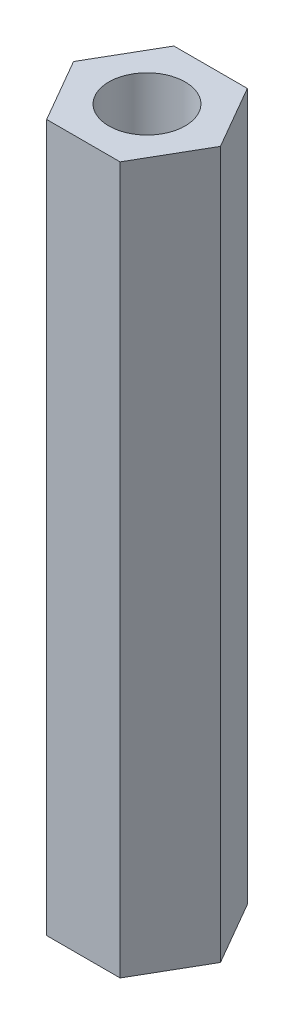
ISO-10303-21;
HEADER;
FILE_DESCRIPTION(('STEP AP214'),'2;1');
FILE_NAME('part.step','',(''),(''),'','','');
FILE_SCHEMA(('AUTOMOTIVE_DESIGN { 1 0 10303 214 1 1 1 1 }'));
ENDSEC;
DATA;
#1=APPLICATION_CONTEXT('core data for automotive mechanical design processes');
#2=APPLICATION_PROTOCOL_DEFINITION('international standard','automotive_design',2000,#1);
#3=PRODUCT_CONTEXT('',#1,'mechanical');
#4=PRODUCT('Part','Part','',(#3));
#5=PRODUCT_RELATED_PRODUCT_CATEGORY('part','',(#4));
#6=PRODUCT_DEFINITION_FORMATION('','',#4);
#7=PRODUCT_DEFINITION_CONTEXT('part definition',#1,'design');
#8=PRODUCT_DEFINITION('design','',#6,#7);
#9=PRODUCT_DEFINITION_SHAPE('','',#8);
#10=(LENGTH_UNIT() NAMED_UNIT(*) SI_UNIT(.MILLI.,.METRE.));
#11=(NAMED_UNIT(*) PLANE_ANGLE_UNIT() SI_UNIT($,.RADIAN.));
#12=(NAMED_UNIT(*) SI_UNIT($,.STERADIAN.) SOLID_ANGLE_UNIT());
#13=UNCERTAINTY_MEASURE_WITH_UNIT(LENGTH_MEASURE(1.E-05),#10,'distance_accuracy_value','');
#14=(GEOMETRIC_REPRESENTATION_CONTEXT(3) GLOBAL_UNCERTAINTY_ASSIGNED_CONTEXT((#13)) GLOBAL_UNIT_ASSIGNED_CONTEXT((#10,
#11,#12)) REPRESENTATION_CONTEXT('',''));
#15=CARTESIAN_POINT('',(0.,0.,0.));
#16=DIRECTION('',(0.,0.,1.));
#17=DIRECTION('',(1.,0.,0.));
#18=AXIS2_PLACEMENT_3D('',#15,#16,#17);
#19=CARTESIAN_POINT('',(0.,25.,0.));
#20=DIRECTION('',(0.,1.,0.));
#21=DIRECTION('',(0.,0.,1.));
#22=AXIS2_PLACEMENT_3D('',#19,#20,#21);
#23=PLANE('',#22);
#24=DIRECTION('',(0.5,0.,0.866025403784439));
#25=VECTOR('',#24,1.);
#26=CARTESIAN_POINT('',(-2.59807621135332,25.,0.));
#27=LINE('',#26,#25);
#28=CARTESIAN_POINT('',(-2.59807621135332,25.,0.));
#29=VERTEX_POINT('',#28);
#30=CARTESIAN_POINT('',(-1.29903810567666,25.,2.25));
#31=VERTEX_POINT('',#30);
#32=EDGE_CURVE('E126',#29,#31,#27,.T.);
#33=ORIENTED_EDGE('',*,*,#32,.T.);
#34=DIRECTION('',(1.,0.,0.));
#35=VECTOR('',#34,1.);
#36=CARTESIAN_POINT('',(-1.29903810567666,25.,2.25));
#37=LINE('',#36,#35);
#38=CARTESIAN_POINT('',(1.29903810567666,25.,2.25));
#39=VERTEX_POINT('',#38);
#40=EDGE_CURVE('E84',#31,#39,#37,.T.);
#41=ORIENTED_EDGE('',*,*,#40,.T.);
#42=DIRECTION('',(0.5,0.,-0.866025403784439));
#43=VECTOR('',#42,1.);
#44=CARTESIAN_POINT('',(1.29903810567666,25.,2.25));
#45=LINE('',#44,#43);
#46=CARTESIAN_POINT('',(2.59807621135332,25.,0.));
#47=VERTEX_POINT('',#46);
#48=EDGE_CURVE('E97',#39,#47,#45,.T.);
#49=ORIENTED_EDGE('',*,*,#48,.T.);
#50=DIRECTION('',(-0.5,0.,-0.866025403784439));
#51=VECTOR('',#50,1.);
#52=CARTESIAN_POINT('',(2.59807621135332,25.,0.));
#53=LINE('',#52,#51);
#54=CARTESIAN_POINT('',(1.29903810567666,25.,-2.25));
#55=VERTEX_POINT('',#54);
#56=EDGE_CURVE('E91',#47,#55,#53,.T.);
#57=ORIENTED_EDGE('',*,*,#56,.T.);
#58=DIRECTION('',(-1.,0.,0.));
#59=VECTOR('',#58,1.);
#60=CARTESIAN_POINT('',(1.29903810567666,25.,-2.25));
#61=LINE('',#60,#59);
#62=CARTESIAN_POINT('',(-1.29903810567666,25.,-2.25));
#63=VERTEX_POINT('',#62);
#64=EDGE_CURVE('E95',#55,#63,#61,.T.);
#65=ORIENTED_EDGE('',*,*,#64,.T.);
#66=DIRECTION('',(-0.5,0.,0.866025403784438));
#67=VECTOR('',#66,1.);
#68=CARTESIAN_POINT('',(-1.29903810567666,25.,-2.25));
#69=LINE('',#68,#67);
#70=EDGE_CURVE('E47',#63,#29,#69,.T.);
#71=ORIENTED_EDGE('',*,*,#70,.T.);
#72=EDGE_LOOP('',(#33,#41,#49,#57,#65,#71));
#73=FACE_BOUND('',#72,.T.);
#74=CARTESIAN_POINT('',(0.,25.,0.));
#75=DIRECTION('',(0.,1.,0.));
#76=DIRECTION('',(0.,0.,1.));
#77=AXIS2_PLACEMENT_3D('',#74,#75,#76);
#78=CIRCLE('',#77,1.35);
#79=CARTESIAN_POINT('',(0.,25.,1.35));
#80=VERTEX_POINT('',#79);
#81=EDGE_CURVE('E119',#80,#80,#78,.T.);
#82=ORIENTED_EDGE('',*,*,#81,.F.);
#83=EDGE_LOOP('',(#82));
#84=FACE_BOUND('',#83,.T.);
#85=ADVANCED_FACE('F30',(#73,#84),#23,.T.);
#86=CARTESIAN_POINT('',(0.,0.,0.));
#87=DIRECTION('',(0.,1.,0.));
#88=DIRECTION('',(0.,0.,1.));
#89=AXIS2_PLACEMENT_3D('',#86,#87,#88);
#90=PLANE('',#89);
#91=DIRECTION('',(0.5,0.,0.866025403784439));
#92=VECTOR('',#91,1.);
#93=CARTESIAN_POINT('',(-2.59807621135332,0.,0.));
#94=LINE('',#93,#92);
#95=CARTESIAN_POINT('',(-2.59807621135332,0.,0.));
#96=VERTEX_POINT('',#95);
#97=CARTESIAN_POINT('',(-1.29903810567666,0.,2.25));
#98=VERTEX_POINT('',#97);
#99=EDGE_CURVE('E115',#96,#98,#94,.T.);
#100=ORIENTED_EDGE('',*,*,#99,.F.);
#101=DIRECTION('',(-0.5,0.,0.866025403784438));
#102=VECTOR('',#101,1.);
#103=CARTESIAN_POINT('',(-1.29903810567666,0.,-2.25));
#104=LINE('',#103,#102);
#105=CARTESIAN_POINT('',(-1.29903810567666,0.,-2.25));
#106=VERTEX_POINT('',#105);
#107=EDGE_CURVE('E76',#106,#96,#104,.T.);
#108=ORIENTED_EDGE('',*,*,#107,.F.);
#109=DIRECTION('',(-1.,0.,0.));
#110=VECTOR('',#109,1.);
#111=CARTESIAN_POINT('',(1.29903810567666,0.,-2.25));
#112=LINE('',#111,#110);
#113=CARTESIAN_POINT('',(1.29903810567666,0.,-2.25));
#114=VERTEX_POINT('',#113);
#115=EDGE_CURVE('E70',#114,#106,#112,.T.);
#116=ORIENTED_EDGE('',*,*,#115,.F.);
#117=DIRECTION('',(-0.5,0.,-0.866025403784439));
#118=VECTOR('',#117,1.);
#119=CARTESIAN_POINT('',(2.59807621135332,0.,0.));
#120=LINE('',#119,#118);
#121=CARTESIAN_POINT('',(2.59807621135332,0.,0.));
#122=VERTEX_POINT('',#121);
#123=EDGE_CURVE('E105',#122,#114,#120,.T.);
#124=ORIENTED_EDGE('',*,*,#123,.F.);
#125=DIRECTION('',(0.5,0.,-0.866025403784439));
#126=VECTOR('',#125,1.);
#127=CARTESIAN_POINT('',(1.29903810567666,0.,2.25));
#128=LINE('',#127,#126);
#129=CARTESIAN_POINT('',(1.29903810567666,0.,2.25));
#130=VERTEX_POINT('',#129);
#131=EDGE_CURVE('E121',#130,#122,#128,.T.);
#132=ORIENTED_EDGE('',*,*,#131,.F.);
#133=DIRECTION('',(1.,0.,0.));
#134=VECTOR('',#133,1.);
#135=CARTESIAN_POINT('',(-1.29903810567666,0.,2.25));
#136=LINE('',#135,#134);
#137=EDGE_CURVE('E118',#98,#130,#136,.T.);
#138=ORIENTED_EDGE('',*,*,#137,.F.);
#139=EDGE_LOOP('',(#100,#108,#116,#124,#132,#138));
#140=FACE_BOUND('',#139,.T.);
#141=CARTESIAN_POINT('',(0.,0.,0.));
#142=DIRECTION('',(0.,1.,0.));
#143=DIRECTION('',(0.,0.,1.));
#144=AXIS2_PLACEMENT_3D('',#141,#142,#143);
#145=CIRCLE('',#144,1.35);
#146=CARTESIAN_POINT('',(0.,0.,1.35));
#147=VERTEX_POINT('',#146);
#148=EDGE_CURVE('E219',#147,#147,#145,.T.);
#149=ORIENTED_EDGE('',*,*,#148,.T.);
#150=EDGE_LOOP('',(#149));
#151=FACE_BOUND('',#150,.T.);
#152=ADVANCED_FACE('F135',(#140,#151),#90,.F.);
#153=CARTESIAN_POINT('',(-2.59807621135332,25.,0.));
#154=DIRECTION('',(0.866025403784439,0.,-0.5));
#155=DIRECTION('',(-0.5,0.,-0.866025403784439));
#156=AXIS2_PLACEMENT_3D('',#153,#154,#155);
#157=PLANE('',#156);
#158=ORIENTED_EDGE('',*,*,#99,.T.);
#159=DIRECTION('',(0.,-1.,0.));
#160=VECTOR('',#159,1.);
#161=CARTESIAN_POINT('',(-1.29903810567666,25.,2.25));
#162=LINE('',#161,#160);
#163=EDGE_CURVE('E11',#31,#98,#162,.T.);
#164=ORIENTED_EDGE('',*,*,#163,.F.);
#165=ORIENTED_EDGE('',*,*,#32,.F.);
#166=DIRECTION('',(0.,-1.,0.));
#167=VECTOR('',#166,1.);
#168=CARTESIAN_POINT('',(-2.59807621135332,25.,0.));
#169=LINE('',#168,#167);
#170=EDGE_CURVE('E111',#29,#96,#169,.T.);
#171=ORIENTED_EDGE('',*,*,#170,.T.);
#172=EDGE_LOOP('',(#158,#164,#165,#171));
#173=FACE_BOUND('',#172,.T.);
#174=ADVANCED_FACE('F32',(#173),#157,.F.);
#175=CARTESIAN_POINT('',(-1.29903810567666,25.,2.25));
#176=DIRECTION('',(0.,0.,-1.));
#177=DIRECTION('',(-1.,0.,0.));
#178=AXIS2_PLACEMENT_3D('',#175,#176,#177);
#179=PLANE('',#178);
#180=ORIENTED_EDGE('',*,*,#137,.T.);
#181=DIRECTION('',(0.,-1.,0.));
#182=VECTOR('',#181,1.);
#183=CARTESIAN_POINT('',(1.29903810567666,25.,2.25));
#184=LINE('',#183,#182);
#185=EDGE_CURVE('E39',#39,#130,#184,.T.);
#186=ORIENTED_EDGE('',*,*,#185,.F.);
#187=ORIENTED_EDGE('',*,*,#40,.F.);
#188=ORIENTED_EDGE('',*,*,#163,.T.);
#189=EDGE_LOOP('',(#180,#186,#187,#188));
#190=FACE_BOUND('',#189,.T.);
#191=ADVANCED_FACE('F160',(#190),#179,.F.);
#192=CARTESIAN_POINT('',(1.29903810567666,25.,2.25));
#193=DIRECTION('',(-0.866025403784439,0.,-0.5));
#194=DIRECTION('',(-0.5,0.,0.866025403784439));
#195=AXIS2_PLACEMENT_3D('',#192,#193,#194);
#196=PLANE('',#195);
#197=ORIENTED_EDGE('',*,*,#131,.T.);
#198=DIRECTION('',(0.,-1.,0.));
#199=VECTOR('',#198,1.);
#200=CARTESIAN_POINT('',(2.59807621135332,25.,0.));
#201=LINE('',#200,#199);
#202=EDGE_CURVE('E106',#47,#122,#201,.T.);
#203=ORIENTED_EDGE('',*,*,#202,.F.);
#204=ORIENTED_EDGE('',*,*,#48,.F.);
#205=ORIENTED_EDGE('',*,*,#185,.T.);
#206=EDGE_LOOP('',(#197,#203,#204,#205));
#207=FACE_BOUND('',#206,.T.);
#208=ADVANCED_FACE('F132',(#207),#196,.F.);
#209=CARTESIAN_POINT('',(2.59807621135332,25.,0.));
#210=DIRECTION('',(-0.866025403784439,0.,0.5));
#211=DIRECTION('',(0.5,0.,0.866025403784439));
#212=AXIS2_PLACEMENT_3D('',#209,#210,#211);
#213=PLANE('',#212);
#214=ORIENTED_EDGE('',*,*,#123,.T.);
#215=DIRECTION('',(0.,-1.,0.));
#216=VECTOR('',#215,1.);
#217=CARTESIAN_POINT('',(1.29903810567666,25.,-2.25));
#218=LINE('',#217,#216);
#219=EDGE_CURVE('E102',#55,#114,#218,.T.);
#220=ORIENTED_EDGE('',*,*,#219,.F.);
#221=ORIENTED_EDGE('',*,*,#56,.F.);
#222=ORIENTED_EDGE('',*,*,#202,.T.);
#223=EDGE_LOOP('',(#214,#220,#221,#222));
#224=FACE_BOUND('',#223,.T.);
#225=ADVANCED_FACE('F103',(#224),#213,.F.);
#226=CARTESIAN_POINT('',(1.29903810567666,25.,-2.25));
#227=DIRECTION('',(0.,0.,1.));
#228=DIRECTION('',(1.,0.,0.));
#229=AXIS2_PLACEMENT_3D('',#226,#227,#228);
#230=PLANE('',#229);
#231=ORIENTED_EDGE('',*,*,#115,.T.);
#232=DIRECTION('',(0.,-1.,0.));
#233=VECTOR('',#232,1.);
#234=CARTESIAN_POINT('',(-1.29903810567666,25.,-2.25));
#235=LINE('',#234,#233);
#236=EDGE_CURVE('E107',#63,#106,#235,.T.);
#237=ORIENTED_EDGE('',*,*,#236,.F.);
#238=ORIENTED_EDGE('',*,*,#64,.F.);
#239=ORIENTED_EDGE('',*,*,#219,.T.);
#240=EDGE_LOOP('',(#231,#237,#238,#239));
#241=FACE_BOUND('',#240,.T.);
#242=ADVANCED_FACE('F109',(#241),#230,.F.);
#243=CARTESIAN_POINT('',(-1.29903810567666,25.,-2.25));
#244=DIRECTION('',(0.866025403784438,0.,0.5));
#245=DIRECTION('',(0.5,0.,-0.866025403784439));
#246=AXIS2_PLACEMENT_3D('',#243,#244,#245);
#247=PLANE('',#246);
#248=ORIENTED_EDGE('',*,*,#107,.T.);
#249=ORIENTED_EDGE('',*,*,#170,.F.);
#250=ORIENTED_EDGE('',*,*,#70,.F.);
#251=ORIENTED_EDGE('',*,*,#236,.T.);
#252=EDGE_LOOP('',(#248,#249,#250,#251));
#253=FACE_BOUND('',#252,.T.);
#254=ADVANCED_FACE('F140',(#253),#247,.F.);
#255=CARTESIAN_POINT('',(0.,25.,0.));
#256=DIRECTION('',(0.,-1.,0.));
#257=DIRECTION('',(0.,0.,-1.));
#258=AXIS2_PLACEMENT_3D('',#255,#256,#257);
#259=CYLINDRICAL_SURFACE('',#258,1.35);
#260=ORIENTED_EDGE('',*,*,#81,.T.);
#261=EDGE_LOOP('',(#260));
#262=FACE_BOUND('',#261,.T.);
#263=ORIENTED_EDGE('',*,*,#148,.F.);
#264=EDGE_LOOP('',(#263));
#265=FACE_BOUND('',#264,.T.);
#266=ADVANCED_FACE('F142',(#262,#265),#259,.F.);
#267=CLOSED_SHELL('',(#85,#152,#174,#191,#208,#225,#242,#254,#266));
#268=MANIFOLD_SOLID_BREP('B2',#267);
#269=ADVANCED_BREP_SHAPE_REPRESENTATION('',(#18,#268),#14);
#270=SHAPE_DEFINITION_REPRESENTATION(#9,#269);
ENDSEC;
END-ISO-10303-21;
